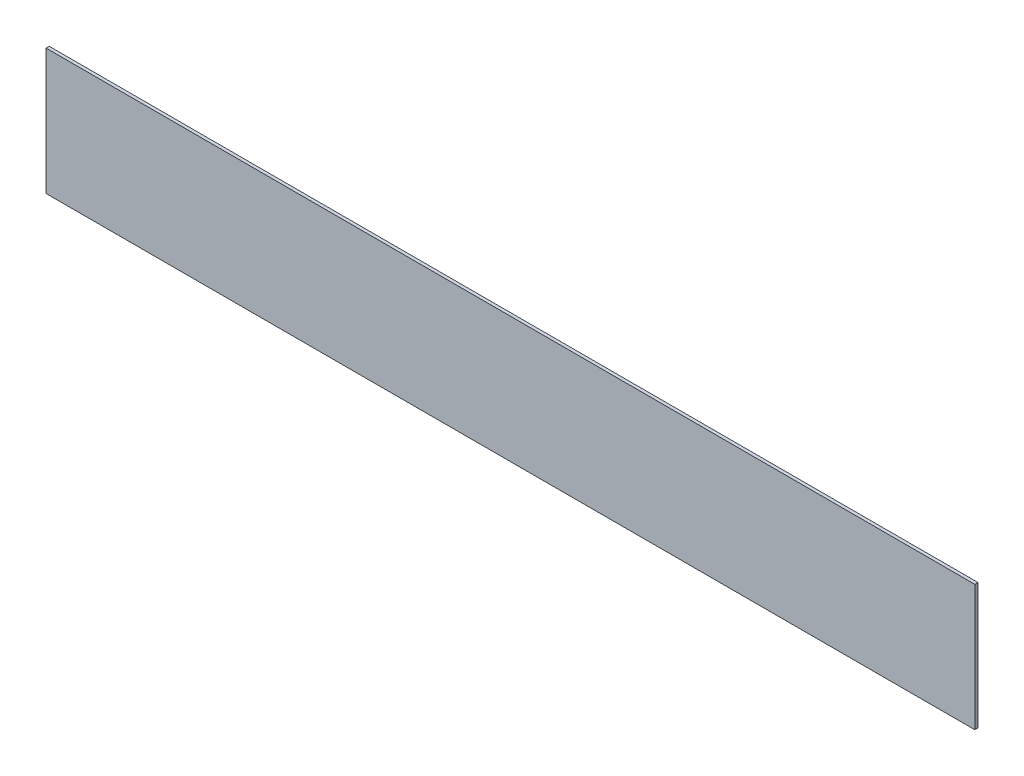
ISO-10303-21;
HEADER;
FILE_DESCRIPTION(('STEP AP214'),'2;1');
FILE_NAME('part.step','',(''),(''),'','','');
FILE_SCHEMA(('AUTOMOTIVE_DESIGN { 1 0 10303 214 1 1 1 1 }'));
ENDSEC;
DATA;
#1=APPLICATION_CONTEXT('core data for automotive mechanical design processes');
#2=APPLICATION_PROTOCOL_DEFINITION('international standard','automotive_design',2000,#1);
#3=PRODUCT_CONTEXT('',#1,'mechanical');
#4=PRODUCT('Part','Part','',(#3));
#5=PRODUCT_RELATED_PRODUCT_CATEGORY('part','',(#4));
#6=PRODUCT_DEFINITION_FORMATION('','',#4);
#7=PRODUCT_DEFINITION_CONTEXT('part definition',#1,'design');
#8=PRODUCT_DEFINITION('design','',#6,#7);
#9=PRODUCT_DEFINITION_SHAPE('','',#8);
#10=(LENGTH_UNIT() NAMED_UNIT(*) SI_UNIT(.MILLI.,.METRE.));
#11=(NAMED_UNIT(*) PLANE_ANGLE_UNIT() SI_UNIT($,.RADIAN.));
#12=(NAMED_UNIT(*) SI_UNIT($,.STERADIAN.) SOLID_ANGLE_UNIT());
#13=UNCERTAINTY_MEASURE_WITH_UNIT(LENGTH_MEASURE(1.E-05),#10,'distance_accuracy_value','');
#14=(GEOMETRIC_REPRESENTATION_CONTEXT(3) GLOBAL_UNCERTAINTY_ASSIGNED_CONTEXT((#13)) GLOBAL_UNIT_ASSIGNED_CONTEXT((#10,
#11,#12)) REPRESENTATION_CONTEXT('',''));
#15=CARTESIAN_POINT('',(0.,0.,0.));
#16=DIRECTION('',(0.,0.,1.));
#17=DIRECTION('',(1.,0.,0.));
#18=AXIS2_PLACEMENT_3D('',#15,#16,#17);
#19=CARTESIAN_POINT('',(0.,0.,2.));
#20=DIRECTION('',(1.,0.,0.));
#21=DIRECTION('',(0.,1.,0.));
#22=AXIS2_PLACEMENT_3D('',#19,#20,#21);
#23=PLANE('',#22);
#24=DIRECTION('',(0.,-1.,0.));
#25=VECTOR('',#24,1.);
#26=CARTESIAN_POINT('',(0.,0.,0.));
#27=LINE('',#26,#25);
#28=CARTESIAN_POINT('',(0.,0.,0.));
#29=VERTEX_POINT('',#28);
#30=CARTESIAN_POINT('',(0.,-80.,0.));
#31=VERTEX_POINT('',#30);
#32=EDGE_CURVE('E100',#29,#31,#27,.T.);
#33=ORIENTED_EDGE('',*,*,#32,.T.);
#34=DIRECTION('',(0.,0.,-1.));
#35=VECTOR('',#34,1.);
#36=CARTESIAN_POINT('',(0.,-80.,2.));
#37=LINE('',#36,#35);
#38=CARTESIAN_POINT('',(0.,-80.,2.));
#39=VERTEX_POINT('',#38);
#40=EDGE_CURVE('E11',#39,#31,#37,.T.);
#41=ORIENTED_EDGE('',*,*,#40,.F.);
#42=DIRECTION('',(0.,-1.,0.));
#43=VECTOR('',#42,1.);
#44=CARTESIAN_POINT('',(0.,0.,2.));
#45=LINE('',#44,#43);
#46=CARTESIAN_POINT('',(0.,0.,2.));
#47=VERTEX_POINT('',#46);
#48=EDGE_CURVE('E88',#47,#39,#45,.T.);
#49=ORIENTED_EDGE('',*,*,#48,.F.);
#50=DIRECTION('',(0.,0.,-1.));
#51=VECTOR('',#50,1.);
#52=CARTESIAN_POINT('',(0.,0.,2.));
#53=LINE('',#52,#51);
#54=EDGE_CURVE('E96',#47,#29,#53,.T.);
#55=ORIENTED_EDGE('',*,*,#54,.T.);
#56=EDGE_LOOP('',(#33,#41,#49,#55));
#57=FACE_BOUND('',#56,.T.);
#58=ADVANCED_FACE('F37',(#57),#23,.F.);
#59=CARTESIAN_POINT('',(0.,-80.,2.));
#60=DIRECTION('',(0.,1.,0.));
#61=DIRECTION('',(0.,0.,1.));
#62=AXIS2_PLACEMENT_3D('',#59,#60,#61);
#63=PLANE('',#62);
#64=DIRECTION('',(1.,0.,0.));
#65=VECTOR('',#64,1.);
#66=CARTESIAN_POINT('',(0.,-80.,0.));
#67=LINE('',#66,#65);
#68=CARTESIAN_POINT('',(590.,-80.,0.));
#69=VERTEX_POINT('',#68);
#70=EDGE_CURVE('E92',#31,#69,#67,.T.);
#71=ORIENTED_EDGE('',*,*,#70,.T.);
#72=DIRECTION('',(0.,0.,-1.));
#73=VECTOR('',#72,1.);
#74=CARTESIAN_POINT('',(590.,-80.,2.));
#75=LINE('',#74,#73);
#76=CARTESIAN_POINT('',(590.,-80.,2.));
#77=VERTEX_POINT('',#76);
#78=EDGE_CURVE('E45',#77,#69,#75,.T.);
#79=ORIENTED_EDGE('',*,*,#78,.F.);
#80=DIRECTION('',(1.,0.,0.));
#81=VECTOR('',#80,1.);
#82=CARTESIAN_POINT('',(0.,-80.,2.));
#83=LINE('',#82,#81);
#84=EDGE_CURVE('E83',#39,#77,#83,.T.);
#85=ORIENTED_EDGE('',*,*,#84,.F.);
#86=ORIENTED_EDGE('',*,*,#40,.T.);
#87=EDGE_LOOP('',(#71,#79,#85,#86));
#88=FACE_BOUND('',#87,.T.);
#89=ADVANCED_FACE('F91',(#88),#63,.F.);
#90=CARTESIAN_POINT('',(590.,0.,2.));
#91=DIRECTION('',(-1.,0.,0.));
#92=DIRECTION('',(0.,0.,1.));
#93=AXIS2_PLACEMENT_3D('',#90,#91,#92);
#94=PLANE('',#93);
#95=DIRECTION('',(0.,1.,0.));
#96=VECTOR('',#95,1.);
#97=CARTESIAN_POINT('',(590.,0.,0.));
#98=LINE('',#97,#96);
#99=CARTESIAN_POINT('',(590.,0.,0.));
#100=VERTEX_POINT('',#99);
#101=EDGE_CURVE('E70',#69,#100,#98,.T.);
#102=ORIENTED_EDGE('',*,*,#101,.T.);
#103=DIRECTION('',(0.,0.,-1.));
#104=VECTOR('',#103,1.);
#105=CARTESIAN_POINT('',(590.,0.,2.));
#106=LINE('',#105,#104);
#107=CARTESIAN_POINT('',(590.,0.,2.));
#108=VERTEX_POINT('',#107);
#109=EDGE_CURVE('E93',#108,#100,#106,.T.);
#110=ORIENTED_EDGE('',*,*,#109,.F.);
#111=DIRECTION('',(0.,1.,0.));
#112=VECTOR('',#111,1.);
#113=CARTESIAN_POINT('',(590.,0.,2.));
#114=LINE('',#113,#112);
#115=EDGE_CURVE('E86',#77,#108,#114,.T.);
#116=ORIENTED_EDGE('',*,*,#115,.F.);
#117=ORIENTED_EDGE('',*,*,#78,.T.);
#118=EDGE_LOOP('',(#102,#110,#116,#117));
#119=FACE_BOUND('',#118,.T.);
#120=ADVANCED_FACE('F94',(#119),#94,.F.);
#121=CARTESIAN_POINT('',(0.,0.,2.));
#122=DIRECTION('',(0.,-1.,0.));
#123=DIRECTION('',(0.,0.,-1.));
#124=AXIS2_PLACEMENT_3D('',#121,#122,#123);
#125=PLANE('',#124);
#126=DIRECTION('',(-1.,0.,0.));
#127=VECTOR('',#126,1.);
#128=CARTESIAN_POINT('',(0.,0.,0.));
#129=LINE('',#128,#127);
#130=EDGE_CURVE('E76',#100,#29,#129,.T.);
#131=ORIENTED_EDGE('',*,*,#130,.T.);
#132=ORIENTED_EDGE('',*,*,#54,.F.);
#133=DIRECTION('',(-1.,0.,0.));
#134=VECTOR('',#133,1.);
#135=CARTESIAN_POINT('',(0.,0.,2.));
#136=LINE('',#135,#134);
#137=EDGE_CURVE('E53',#108,#47,#136,.T.);
#138=ORIENTED_EDGE('',*,*,#137,.F.);
#139=ORIENTED_EDGE('',*,*,#109,.T.);
#140=EDGE_LOOP('',(#131,#132,#138,#139));
#141=FACE_BOUND('',#140,.T.);
#142=ADVANCED_FACE('F107',(#141),#125,.F.);
#143=CARTESIAN_POINT('',(0.,0.,2.));
#144=DIRECTION('',(0.,0.,1.));
#145=DIRECTION('',(1.,0.,0.));
#146=AXIS2_PLACEMENT_3D('',#143,#144,#145);
#147=PLANE('',#146);
#148=ORIENTED_EDGE('',*,*,#48,.T.);
#149=ORIENTED_EDGE('',*,*,#84,.T.);
#150=ORIENTED_EDGE('',*,*,#115,.T.);
#151=ORIENTED_EDGE('',*,*,#137,.T.);
#152=EDGE_LOOP('',(#148,#149,#150,#151));
#153=FACE_BOUND('',#152,.T.);
#154=ADVANCED_FACE('F84',(#153),#147,.T.);
#155=CARTESIAN_POINT('',(0.,0.,0.));
#156=DIRECTION('',(0.,0.,1.));
#157=DIRECTION('',(1.,0.,0.));
#158=AXIS2_PLACEMENT_3D('',#155,#156,#157);
#159=PLANE('',#158);
#160=ORIENTED_EDGE('',*,*,#32,.F.);
#161=ORIENTED_EDGE('',*,*,#130,.F.);
#162=ORIENTED_EDGE('',*,*,#101,.F.);
#163=ORIENTED_EDGE('',*,*,#70,.F.);
#164=EDGE_LOOP('',(#160,#161,#162,#163));
#165=FACE_BOUND('',#164,.T.);
#166=ADVANCED_FACE('F110',(#165),#159,.F.);
#167=CLOSED_SHELL('',(#58,#89,#120,#142,#154,#166));
#168=MANIFOLD_SOLID_BREP('B2',#167);
#169=ADVANCED_BREP_SHAPE_REPRESENTATION('',(#18,#168),#14);
#170=SHAPE_DEFINITION_REPRESENTATION(#9,#169);
ENDSEC;
END-ISO-10303-21;
